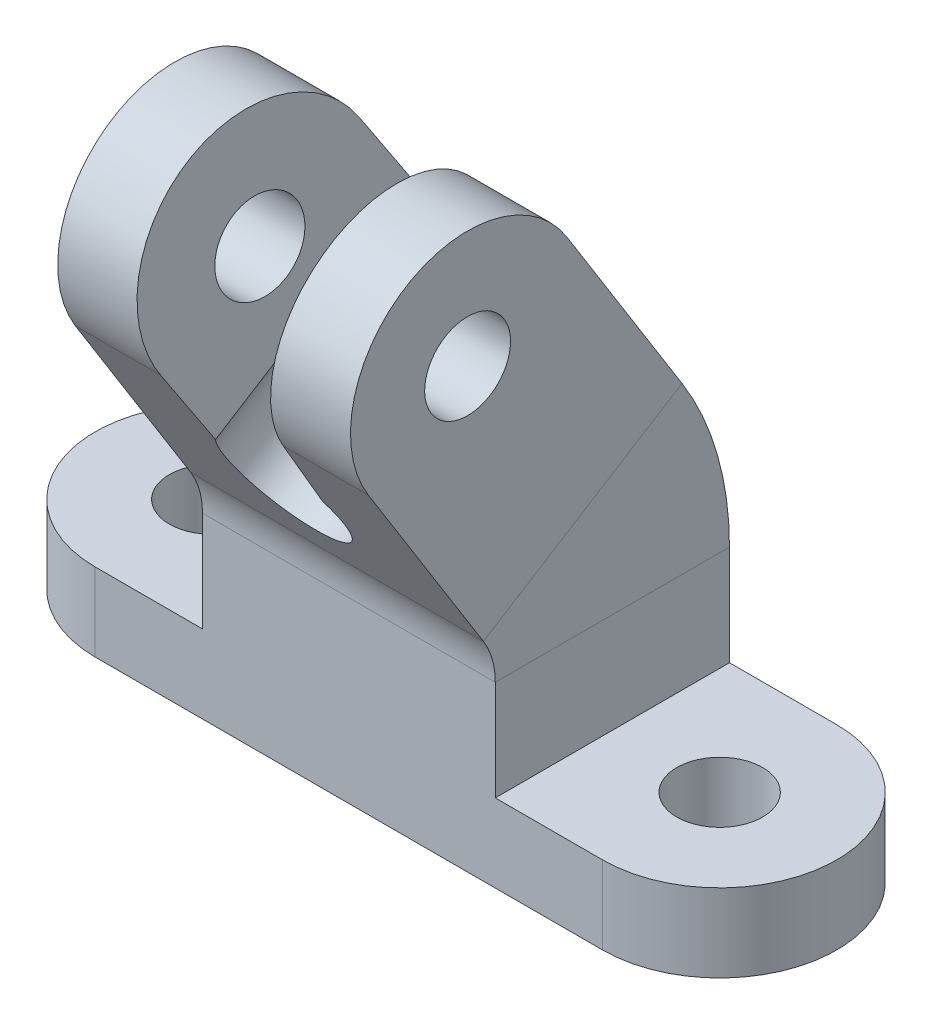
ISO-10303-21;
HEADER;
FILE_DESCRIPTION(('STEP AP214'),'2;1');
FILE_NAME('part.step','',(''),(''),'','','');
FILE_SCHEMA(('AUTOMOTIVE_DESIGN { 1 0 10303 214 1 1 1 1 }'));
ENDSEC;
DATA;
#1=APPLICATION_CONTEXT('core data for automotive mechanical design processes');
#2=APPLICATION_PROTOCOL_DEFINITION('international standard','automotive_design',2000,#1);
#3=PRODUCT_CONTEXT('',#1,'mechanical');
#4=PRODUCT('Part','Part','',(#3));
#5=PRODUCT_RELATED_PRODUCT_CATEGORY('part','',(#4));
#6=PRODUCT_DEFINITION_FORMATION('','',#4);
#7=PRODUCT_DEFINITION_CONTEXT('part definition',#1,'design');
#8=PRODUCT_DEFINITION('design','',#6,#7);
#9=PRODUCT_DEFINITION_SHAPE('','',#8);
#10=(LENGTH_UNIT() NAMED_UNIT(*) SI_UNIT(.MILLI.,.METRE.));
#11=(NAMED_UNIT(*) PLANE_ANGLE_UNIT() SI_UNIT($,.RADIAN.));
#12=(NAMED_UNIT(*) SI_UNIT($,.STERADIAN.) SOLID_ANGLE_UNIT());
#13=UNCERTAINTY_MEASURE_WITH_UNIT(LENGTH_MEASURE(1.E-05),#10,'distance_accuracy_value','');
#14=(GEOMETRIC_REPRESENTATION_CONTEXT(3) GLOBAL_UNCERTAINTY_ASSIGNED_CONTEXT((#13)) GLOBAL_UNIT_ASSIGNED_CONTEXT((#10,
#11,#12)) REPRESENTATION_CONTEXT('',''));
#15=CARTESIAN_POINT('',(0.,0.,0.));
#16=DIRECTION('',(0.,0.,1.));
#17=DIRECTION('',(1.,0.,0.));
#18=AXIS2_PLACEMENT_3D('',#15,#16,#17);
#19=CARTESIAN_POINT('',(-3.75,11.936336673095,3.70943484963244));
#20=DIRECTION('',(-1.,0.,0.));
#21=DIRECTION('',(0.,0.,1.));
#22=AXIS2_PLACEMENT_3D('',#19,#20,#21);
#23=CYLINDRICAL_SURFACE('',#22,3.);
#24=DIRECTION('',(1.,0.,0.));
#25=VECTOR('',#24,1.);
#26=CARTESIAN_POINT('',(-3.75,10.3465788803954,6.25357913810172));
#27=LINE('',#26,#25);
#28=CARTESIAN_POINT('',(-1.5718252820929,10.3465788803954,6.25357913810172));
#29=VERTEX_POINT('',#28);
#30=CARTESIAN_POINT('',(-3.75,10.3465788803954,6.25357913810172));
#31=VERTEX_POINT('',#30);
#32=EDGE_CURVE('E62',#29,#31,#27,.F.);
#33=ORIENTED_EDGE('',*,*,#32,.F.);
#34=CARTESIAN_POINT('',(-1.5718252820929,11.936336673095,3.70943484963244));
#35=DIRECTION('',(0.996194698091746,0.0739122617062452,0.0461855070705341));
#36=DIRECTION('',(-0.0871557427476517,0.84482101711783,0.527902761445799));
#37=AXIS2_PLACEMENT_3D('',#34,#35,#36);
#38=ELLIPSE('',#37,3.01145951263004,3.);
#39=CARTESIAN_POINT('',(-1.5718252820929,13.5260944657946,1.16529056116316));
#40=VERTEX_POINT('',#39);
#41=EDGE_CURVE('E164',#29,#40,#38,.F.);
#42=ORIENTED_EDGE('',*,*,#41,.T.);
#43=DIRECTION('',(1.,0.,0.));
#44=VECTOR('',#43,1.);
#45=CARTESIAN_POINT('',(-3.75,13.5260944657946,1.16529056116317));
#46=LINE('',#45,#44);
#47=CARTESIAN_POINT('',(-3.75,13.5260944657946,1.16529056116316));
#48=VERTEX_POINT('',#47);
#49=EDGE_CURVE('E288',#48,#40,#46,.T.);
#50=ORIENTED_EDGE('',*,*,#49,.F.);
#51=CARTESIAN_POINT('',(-3.75,11.936336673095,3.70943484963244));
#52=DIRECTION('',(-1.,0.,0.));
#53=DIRECTION('',(0.,0.,1.));
#54=AXIS2_PLACEMENT_3D('',#51,#52,#53);
#55=CIRCLE('',#54,3.);
#56=EDGE_CURVE('E293',#31,#48,#55,.T.);
#57=ORIENTED_EDGE('',*,*,#56,.F.);
#58=EDGE_LOOP('',(#33,#42,#50,#57));
#59=FACE_BOUND('',#58,.T.);
#60=ADVANCED_FACE('F37',(#59),#23,.T.);
#61=CARTESIAN_POINT('',(1.5718252820929,11.936336673095,3.70943484963244));
#62=DIRECTION('',(0.996194698091746,-0.0739122617062449,-0.0461855070705341));
#63=DIRECTION('',(-0.0871557427476514,-0.84482101711783,-0.527902761445799));
#64=AXIS2_PLACEMENT_3D('',#61,#62,#63);
#65=ELLIPSE('',#64,3.01145951263004,3.);
#66=CARTESIAN_POINT('',(1.5718252820929,10.3465788803954,6.25357913810172));
#67=VERTEX_POINT('',#66);
#68=CARTESIAN_POINT('',(1.5718252820929,13.5260944657946,1.16529056116316));
#69=VERTEX_POINT('',#68);
#70=EDGE_CURVE('E175',#67,#69,#65,.F.);
#71=ORIENTED_EDGE('',*,*,#70,.F.);
#72=CARTESIAN_POINT('',(3.75,10.3465788803954,6.25357913810172));
#73=VERTEX_POINT('',#72);
#74=EDGE_CURVE('E291',#73,#67,#27,.F.);
#75=ORIENTED_EDGE('',*,*,#74,.F.);
#76=CARTESIAN_POINT('',(3.75,11.936336673095,3.70943484963244));
#77=DIRECTION('',(1.,0.,0.));
#78=DIRECTION('',(0.,0.,-1.));
#79=AXIS2_PLACEMENT_3D('',#76,#77,#78);
#80=CIRCLE('',#79,3.);
#81=CARTESIAN_POINT('',(3.75,13.5260944657946,1.16529056116316));
#82=VERTEX_POINT('',#81);
#83=EDGE_CURVE('E295',#82,#73,#80,.T.);
#84=ORIENTED_EDGE('',*,*,#83,.F.);
#85=EDGE_CURVE('E283',#69,#82,#46,.T.);
#86=ORIENTED_EDGE('',*,*,#85,.F.);
#87=EDGE_LOOP('',(#71,#75,#84,#86));
#88=FACE_BOUND('',#87,.T.);
#89=ADVANCED_FACE('F40',(#88),#23,.T.);
#90=CARTESIAN_POINT('',(-6.5,2.,0.));
#91=DIRECTION('',(0.,1.,0.));
#92=DIRECTION('',(0.,0.,1.));
#93=AXIS2_PLACEMENT_3D('',#90,#91,#92);
#94=PLANE('',#93);
#95=DIRECTION('',(0.,0.,1.));
#96=VECTOR('',#95,1.);
#97=CARTESIAN_POINT('',(-3.75,2.,-3.));
#98=LINE('',#97,#96);
#99=CARTESIAN_POINT('',(-3.75,2.,-3.));
#100=VERTEX_POINT('',#99);
#101=CARTESIAN_POINT('',(-3.75,2.,3.));
#102=VERTEX_POINT('',#101);
#103=EDGE_CURVE('E177',#100,#102,#98,.T.);
#104=ORIENTED_EDGE('',*,*,#103,.F.);
#105=DIRECTION('',(-1.,0.,0.));
#106=VECTOR('',#105,1.);
#107=CARTESIAN_POINT('',(-6.5,2.,-3.));
#108=LINE('',#107,#106);
#109=CARTESIAN_POINT('',(-6.5,2.,-3.));
#110=VERTEX_POINT('',#109);
#111=EDGE_CURVE('E259',#100,#110,#108,.T.);
#112=ORIENTED_EDGE('',*,*,#111,.T.);
#113=CARTESIAN_POINT('',(-6.5,2.,0.));
#114=DIRECTION('',(0.,1.,0.));
#115=DIRECTION('',(0.,0.,1.));
#116=AXIS2_PLACEMENT_3D('',#113,#114,#115);
#117=CIRCLE('',#116,3.);
#118=CARTESIAN_POINT('',(-6.5,2.,3.));
#119=VERTEX_POINT('',#118);
#120=EDGE_CURVE('E250',#110,#119,#117,.T.);
#121=ORIENTED_EDGE('',*,*,#120,.T.);
#122=DIRECTION('',(1.,0.,0.));
#123=VECTOR('',#122,1.);
#124=CARTESIAN_POINT('',(-6.5,2.,3.));
#125=LINE('',#124,#123);
#126=EDGE_CURVE('E255',#119,#102,#125,.T.);
#127=ORIENTED_EDGE('',*,*,#126,.T.);
#128=EDGE_LOOP('',(#104,#112,#121,#127));
#129=FACE_BOUND('',#128,.T.);
#130=CARTESIAN_POINT('',(-6.5,2.,0.));
#131=DIRECTION('',(0.,1.,0.));
#132=DIRECTION('',(0.,0.,1.));
#133=AXIS2_PLACEMENT_3D('',#130,#131,#132);
#134=CIRCLE('',#133,1.1);
#135=CARTESIAN_POINT('',(-6.5,2.,1.1));
#136=VERTEX_POINT('',#135);
#137=EDGE_CURVE('E239',#136,#136,#134,.T.);
#138=ORIENTED_EDGE('',*,*,#137,.F.);
#139=EDGE_LOOP('',(#138));
#140=FACE_BOUND('',#139,.T.);
#141=ADVANCED_FACE('F326',(#129,#140),#94,.T.);
#142=CARTESIAN_POINT('',(-6.5,2.,0.));
#143=DIRECTION('',(0.,-1.,0.));
#144=DIRECTION('',(0.,0.,-1.));
#145=AXIS2_PLACEMENT_3D('',#142,#143,#144);
#146=CYLINDRICAL_SURFACE('',#145,3.);
#147=CARTESIAN_POINT('',(-6.5,0.,0.));
#148=DIRECTION('',(0.,1.,0.));
#149=DIRECTION('',(0.,0.,1.));
#150=AXIS2_PLACEMENT_3D('',#147,#148,#149);
#151=CIRCLE('',#150,3.);
#152=CARTESIAN_POINT('',(-6.5,0.,-3.));
#153=VERTEX_POINT('',#152);
#154=CARTESIAN_POINT('',(-6.5,0.,3.));
#155=VERTEX_POINT('',#154);
#156=EDGE_CURVE('E263',#153,#155,#151,.T.);
#157=ORIENTED_EDGE('',*,*,#156,.T.);
#158=DIRECTION('',(0.,-1.,0.));
#159=VECTOR('',#158,1.);
#160=CARTESIAN_POINT('',(-6.5,2.,3.));
#161=LINE('',#160,#159);
#162=EDGE_CURVE('E280',#119,#155,#161,.T.);
#163=ORIENTED_EDGE('',*,*,#162,.F.);
#164=ORIENTED_EDGE('',*,*,#120,.F.);
#165=DIRECTION('',(0.,-1.,0.));
#166=VECTOR('',#165,1.);
#167=CARTESIAN_POINT('',(-6.5,2.,-3.));
#168=LINE('',#167,#166);
#169=EDGE_CURVE('E262',#110,#153,#168,.T.);
#170=ORIENTED_EDGE('',*,*,#169,.T.);
#171=EDGE_LOOP('',(#157,#163,#164,#170));
#172=FACE_BOUND('',#171,.T.);
#173=ADVANCED_FACE('F370',(#172),#146,.T.);
#174=CARTESIAN_POINT('',(-6.5,2.,3.));
#175=DIRECTION('',(0.,0.,-1.));
#176=DIRECTION('',(-1.,0.,0.));
#177=AXIS2_PLACEMENT_3D('',#174,#175,#176);
#178=PLANE('',#177);
#179=DIRECTION('',(1.,0.,0.));
#180=VECTOR('',#179,1.);
#181=CARTESIAN_POINT('',(-6.5,0.,3.));
#182=LINE('',#181,#180);
#183=CARTESIAN_POINT('',(6.5,0.,3.));
#184=VERTEX_POINT('',#183);
#185=EDGE_CURVE('E266',#155,#184,#182,.T.);
#186=ORIENTED_EDGE('',*,*,#185,.T.);
#187=DIRECTION('',(0.,-1.,0.));
#188=VECTOR('',#187,1.);
#189=CARTESIAN_POINT('',(6.5,2.,3.));
#190=LINE('',#189,#188);
#191=CARTESIAN_POINT('',(6.5,2.,3.));
#192=VERTEX_POINT('',#191);
#193=EDGE_CURVE('E277',#192,#184,#190,.T.);
#194=ORIENTED_EDGE('',*,*,#193,.F.);
#195=CARTESIAN_POINT('',(3.75,2.,3.));
#196=VERTEX_POINT('',#195);
#197=EDGE_CURVE('E253',#196,#192,#125,.T.);
#198=ORIENTED_EDGE('',*,*,#197,.F.);
#199=DIRECTION('',(0.,1.,0.));
#200=VECTOR('',#199,1.);
#201=CARTESIAN_POINT('',(3.75,2.,3.));
#202=LINE('',#201,#200);
#203=CARTESIAN_POINT('',(3.75,4.56627307120596,3.));
#204=VERTEX_POINT('',#203);
#205=EDGE_CURVE('E212',#196,#204,#202,.T.);
#206=ORIENTED_EDGE('',*,*,#205,.T.);
#207=DIRECTION('',(1.,0.,0.));
#208=VECTOR('',#207,1.);
#209=CARTESIAN_POINT('',(3.75,4.56627307120596,3.));
#210=LINE('',#209,#208);
#211=CARTESIAN_POINT('',(-3.75,4.56627307120596,3.));
#212=VERTEX_POINT('',#211);
#213=EDGE_CURVE('E188',#212,#204,#210,.T.);
#214=ORIENTED_EDGE('',*,*,#213,.F.);
#215=DIRECTION('',(0.,1.,0.));
#216=VECTOR('',#215,1.);
#217=CARTESIAN_POINT('',(-3.75,2.,3.));
#218=LINE('',#217,#216);
#219=EDGE_CURVE('E184',#102,#212,#218,.T.);
#220=ORIENTED_EDGE('',*,*,#219,.F.);
#221=ORIENTED_EDGE('',*,*,#126,.F.);
#222=ORIENTED_EDGE('',*,*,#162,.T.);
#223=EDGE_LOOP('',(#186,#194,#198,#206,#214,#220,#221,#222));
#224=FACE_BOUND('',#223,.T.);
#225=ADVANCED_FACE('F330',(#224),#178,.F.);
#226=CARTESIAN_POINT('',(6.5,2.,0.));
#227=DIRECTION('',(0.,-1.,0.));
#228=DIRECTION('',(0.,0.,-1.));
#229=AXIS2_PLACEMENT_3D('',#226,#227,#228);
#230=CYLINDRICAL_SURFACE('',#229,3.);
#231=CARTESIAN_POINT('',(6.5,0.,0.));
#232=DIRECTION('',(0.,1.,0.));
#233=DIRECTION('',(0.,0.,1.));
#234=AXIS2_PLACEMENT_3D('',#231,#232,#233);
#235=CIRCLE('',#234,3.);
#236=CARTESIAN_POINT('',(6.5,0.,-3.));
#237=VERTEX_POINT('',#236);
#238=EDGE_CURVE('E269',#184,#237,#235,.T.);
#239=ORIENTED_EDGE('',*,*,#238,.T.);
#240=DIRECTION('',(0.,-1.,0.));
#241=VECTOR('',#240,1.);
#242=CARTESIAN_POINT('',(6.5,2.,-3.));
#243=LINE('',#242,#241);
#244=CARTESIAN_POINT('',(6.5,2.,-3.));
#245=VERTEX_POINT('',#244);
#246=EDGE_CURVE('E274',#245,#237,#243,.T.);
#247=ORIENTED_EDGE('',*,*,#246,.F.);
#248=CARTESIAN_POINT('',(6.5,2.,0.));
#249=DIRECTION('',(0.,1.,0.));
#250=DIRECTION('',(0.,0.,1.));
#251=AXIS2_PLACEMENT_3D('',#248,#249,#250);
#252=CIRCLE('',#251,3.);
#253=EDGE_CURVE('E257',#192,#245,#252,.T.);
#254=ORIENTED_EDGE('',*,*,#253,.F.);
#255=ORIENTED_EDGE('',*,*,#193,.T.);
#256=EDGE_LOOP('',(#239,#247,#254,#255));
#257=FACE_BOUND('',#256,.T.);
#258=ADVANCED_FACE('F388',(#257),#230,.T.);
#259=CARTESIAN_POINT('',(-6.5,2.,-3.));
#260=DIRECTION('',(0.,0.,1.));
#261=DIRECTION('',(1.,0.,0.));
#262=AXIS2_PLACEMENT_3D('',#259,#260,#261);
#263=PLANE('',#262);
#264=DIRECTION('',(-1.,0.,0.));
#265=VECTOR('',#264,1.);
#266=CARTESIAN_POINT('',(-6.5,0.,-3.));
#267=LINE('',#266,#265);
#268=EDGE_CURVE('E254',#237,#153,#267,.T.);
#269=ORIENTED_EDGE('',*,*,#268,.T.);
#270=ORIENTED_EDGE('',*,*,#169,.F.);
#271=ORIENTED_EDGE('',*,*,#111,.F.);
#272=DIRECTION('',(0.,1.,0.));
#273=VECTOR('',#272,1.);
#274=CARTESIAN_POINT('',(-3.75,2.,-3.));
#275=LINE('',#274,#273);
#276=CARTESIAN_POINT('',(-3.75,4.56627307120596,-3.));
#277=VERTEX_POINT('',#276);
#278=EDGE_CURVE('E185',#100,#277,#275,.T.);
#279=ORIENTED_EDGE('',*,*,#278,.T.);
#280=DIRECTION('',(-1.,0.,0.));
#281=VECTOR('',#280,1.);
#282=CARTESIAN_POINT('',(3.75,4.56627307120596,-3.));
#283=LINE('',#282,#281);
#284=CARTESIAN_POINT('',(3.75,4.56627307120596,-3.));
#285=VERTEX_POINT('',#284);
#286=EDGE_CURVE('E201',#285,#277,#283,.T.);
#287=ORIENTED_EDGE('',*,*,#286,.F.);
#288=DIRECTION('',(0.,1.,0.));
#289=VECTOR('',#288,1.);
#290=CARTESIAN_POINT('',(3.75,2.,-3.));
#291=LINE('',#290,#289);
#292=CARTESIAN_POINT('',(3.75,2.,-3.));
#293=VERTEX_POINT('',#292);
#294=EDGE_CURVE('E229',#293,#285,#291,.T.);
#295=ORIENTED_EDGE('',*,*,#294,.F.);
#296=EDGE_CURVE('E260',#245,#293,#108,.T.);
#297=ORIENTED_EDGE('',*,*,#296,.F.);
#298=ORIENTED_EDGE('',*,*,#246,.T.);
#299=EDGE_LOOP('',(#269,#270,#271,#279,#287,#295,#297,#298));
#300=FACE_BOUND('',#299,.T.);
#301=ADVANCED_FACE('F321',(#300),#263,.F.);
#302=DIRECTION('',(0.,0.,-1.));
#303=VECTOR('',#302,1.);
#304=CARTESIAN_POINT('',(3.75,2.,-3.));
#305=LINE('',#304,#303);
#306=EDGE_CURVE('E180',#196,#293,#305,.T.);
#307=ORIENTED_EDGE('',*,*,#306,.F.);
#308=ORIENTED_EDGE('',*,*,#197,.T.);
#309=ORIENTED_EDGE('',*,*,#253,.T.);
#310=ORIENTED_EDGE('',*,*,#296,.T.);
#311=EDGE_LOOP('',(#307,#308,#309,#310));
#312=FACE_BOUND('',#311,.T.);
#313=CARTESIAN_POINT('',(6.5,2.,0.));
#314=DIRECTION('',(0.,1.,0.));
#315=DIRECTION('',(0.,0.,1.));
#316=AXIS2_PLACEMENT_3D('',#313,#314,#315);
#317=CIRCLE('',#316,1.1);
#318=CARTESIAN_POINT('',(6.5,2.,1.1));
#319=VERTEX_POINT('',#318);
#320=EDGE_CURVE('E244',#319,#319,#317,.T.);
#321=ORIENTED_EDGE('',*,*,#320,.F.);
#322=EDGE_LOOP('',(#321));
#323=FACE_BOUND('',#322,.T.);
#324=ADVANCED_FACE('F372',(#312,#323),#94,.T.);
#325=CARTESIAN_POINT('',(-6.5,0.,0.));
#326=DIRECTION('',(0.,1.,0.));
#327=DIRECTION('',(0.,0.,1.));
#328=AXIS2_PLACEMENT_3D('',#325,#326,#327);
#329=PLANE('',#328);
#330=CARTESIAN_POINT('',(6.5,0.,0.));
#331=DIRECTION('',(0.,1.,0.));
#332=DIRECTION('',(0.,0.,1.));
#333=AXIS2_PLACEMENT_3D('',#330,#331,#332);
#334=CIRCLE('',#333,1.1);
#335=CARTESIAN_POINT('',(6.5,0.,1.1));
#336=VERTEX_POINT('',#335);
#337=EDGE_CURVE('E267',#336,#336,#334,.T.);
#338=ORIENTED_EDGE('',*,*,#337,.T.);
#339=EDGE_LOOP('',(#338));
#340=FACE_BOUND('',#339,.T.);
#341=CARTESIAN_POINT('',(-6.5,0.,0.));
#342=DIRECTION('',(0.,1.,0.));
#343=DIRECTION('',(0.,0.,1.));
#344=AXIS2_PLACEMENT_3D('',#341,#342,#343);
#345=CIRCLE('',#344,1.1);
#346=CARTESIAN_POINT('',(-6.5,0.,1.1));
#347=VERTEX_POINT('',#346);
#348=EDGE_CURVE('E247',#347,#347,#345,.T.);
#349=ORIENTED_EDGE('',*,*,#348,.T.);
#350=EDGE_LOOP('',(#349));
#351=FACE_BOUND('',#350,.T.);
#352=ORIENTED_EDGE('',*,*,#156,.F.);
#353=ORIENTED_EDGE('',*,*,#268,.F.);
#354=ORIENTED_EDGE('',*,*,#238,.F.);
#355=ORIENTED_EDGE('',*,*,#185,.F.);
#356=EDGE_LOOP('',(#352,#353,#354,#355));
#357=FACE_BOUND('',#356,.T.);
#358=ADVANCED_FACE('F380',(#340,#351,#357),#329,.F.);
#359=CARTESIAN_POINT('',(-6.5,-1.5,0.));
#360=DIRECTION('',(0.,1.,0.));
#361=DIRECTION('',(0.,0.,1.));
#362=AXIS2_PLACEMENT_3D('',#359,#360,#361);
#363=CYLINDRICAL_SURFACE('',#362,1.1);
#364=ORIENTED_EDGE('',*,*,#137,.T.);
#365=EDGE_LOOP('',(#364));
#366=FACE_BOUND('',#365,.T.);
#367=ORIENTED_EDGE('',*,*,#348,.F.);
#368=EDGE_LOOP('',(#367));
#369=FACE_BOUND('',#368,.T.);
#370=ADVANCED_FACE('F386',(#366,#369),#363,.F.);
#371=CARTESIAN_POINT('',(6.5,-1.5,0.));
#372=DIRECTION('',(0.,1.,0.));
#373=DIRECTION('',(0.,0.,1.));
#374=AXIS2_PLACEMENT_3D('',#371,#372,#373);
#375=CYLINDRICAL_SURFACE('',#374,1.1);
#376=ORIENTED_EDGE('',*,*,#320,.T.);
#377=EDGE_LOOP('',(#376));
#378=FACE_BOUND('',#377,.T.);
#379=ORIENTED_EDGE('',*,*,#337,.F.);
#380=EDGE_LOOP('',(#379));
#381=FACE_BOUND('',#380,.T.);
#382=ADVANCED_FACE('F393',(#378,#381),#375,.F.);
#383=CARTESIAN_POINT('',(-3.75,2.,-3.));
#384=DIRECTION('',(-1.,0.,0.));
#385=DIRECTION('',(0.,0.,1.));
#386=AXIS2_PLACEMENT_3D('',#383,#384,#385);
#387=PLANE('',#386);
#388=ORIENTED_EDGE('',*,*,#219,.T.);
#389=DIRECTION('',(0.,0.,1.));
#390=VECTOR('',#389,1.);
#391=CARTESIAN_POINT('',(-3.75,4.56627307120596,-3.));
#392=LINE('',#391,#390);
#393=EDGE_CURVE('E181',#277,#212,#392,.T.);
#394=ORIENTED_EDGE('',*,*,#393,.F.);
#395=ORIENTED_EDGE('',*,*,#278,.F.);
#396=ORIENTED_EDGE('',*,*,#103,.T.);
#397=EDGE_LOOP('',(#388,#394,#395,#396));
#398=FACE_BOUND('',#397,.T.);
#399=ADVANCED_FACE('F316',(#398),#387,.T.);
#400=CARTESIAN_POINT('',(3.75,2.,-3.));
#401=DIRECTION('',(1.,0.,0.));
#402=DIRECTION('',(0.,0.,-1.));
#403=AXIS2_PLACEMENT_3D('',#400,#401,#402);
#404=PLANE('',#403);
#405=ORIENTED_EDGE('',*,*,#294,.T.);
#406=DIRECTION('',(0.,0.,-1.));
#407=VECTOR('',#406,1.);
#408=CARTESIAN_POINT('',(3.75,4.56627307120596,-3.));
#409=LINE('',#408,#407);
#410=EDGE_CURVE('E215',#204,#285,#409,.T.);
#411=ORIENTED_EDGE('',*,*,#410,.F.);
#412=ORIENTED_EDGE('',*,*,#205,.F.);
#413=ORIENTED_EDGE('',*,*,#306,.T.);
#414=EDGE_LOOP('',(#405,#411,#412,#413));
#415=FACE_BOUND('',#414,.T.);
#416=ADVANCED_FACE('F336',(#415),#404,.T.);
#417=CARTESIAN_POINT('',(-3.75,4.56627307120596,-3.));
#418=DIRECTION('',(-1.,0.,0.));
#419=DIRECTION('',(0.,0.,1.));
#420=AXIS2_PLACEMENT_3D('',#417,#418,#419);
#421=PLANE('',#420);
#422=CARTESIAN_POINT('',(-3.75,4.56627307120596,5.));
#423=DIRECTION('',(1.,0.,0.));
#424=DIRECTION('',(0.,0.,-1.));
#425=AXIS2_PLACEMENT_3D('',#422,#423,#424);
#426=CIRCLE('',#425,2.);
#427=CARTESIAN_POINT('',(-3.75,5.62611159967237,3.30390380768715));
#428=VERTEX_POINT('',#427);
#429=EDGE_CURVE('E194',#212,#428,#426,.T.);
#430=ORIENTED_EDGE('',*,*,#429,.T.);
#431=DIRECTION('',(0.,-0.529919264233206,0.848048096156426));
#432=VECTOR('',#431,1.);
#433=CARTESIAN_POINT('',(-3.75,8.8056271850716,-1.7843847692514));
#434=LINE('',#433,#432);
#435=CARTESIAN_POINT('',(-3.75,8.8056271850716,-1.7843847692514));
#436=VERTEX_POINT('',#435);
#437=EDGE_CURVE('E191',#436,#428,#434,.T.);
#438=ORIENTED_EDGE('',*,*,#437,.F.);
#439=CARTESIAN_POINT('',(-3.75,4.56627307120596,5.));
#440=DIRECTION('',(1.,0.,0.));
#441=DIRECTION('',(0.,0.,-1.));
#442=AXIS2_PLACEMENT_3D('',#439,#440,#441);
#443=CIRCLE('',#442,8.);
#444=EDGE_CURVE('E195',#277,#436,#443,.T.);
#445=ORIENTED_EDGE('',*,*,#444,.F.);
#446=ORIENTED_EDGE('',*,*,#393,.T.);
#447=EDGE_LOOP('',(#430,#438,#445,#446));
#448=FACE_BOUND('',#447,.T.);
#449=ADVANCED_FACE('F312',(#448),#421,.T.);
#450=CARTESIAN_POINT('',(0.,4.56627307120596,5.));
#451=DIRECTION('',(1.,0.,0.));
#452=DIRECTION('',(0.,0.,-1.));
#453=AXIS2_PLACEMENT_3D('',#450,#451,#452);
#454=CYLINDRICAL_SURFACE('',#453,2.);
#455=CARTESIAN_POINT('',(3.75,4.56627307120596,5.));
#456=DIRECTION('',(1.,0.,0.));
#457=DIRECTION('',(0.,0.,-1.));
#458=AXIS2_PLACEMENT_3D('',#455,#456,#457);
#459=CIRCLE('',#458,2.);
#460=CARTESIAN_POINT('',(3.75,5.62611159967237,3.30390380768715));
#461=VERTEX_POINT('',#460);
#462=EDGE_CURVE('E218',#204,#461,#459,.T.);
#463=ORIENTED_EDGE('',*,*,#462,.T.);
#464=DIRECTION('',(1.,0.,0.));
#465=VECTOR('',#464,1.);
#466=CARTESIAN_POINT('',(3.75,5.62611159967237,3.30390380768715));
#467=LINE('',#466,#465);
#468=EDGE_CURVE('E198',#428,#461,#467,.T.);
#469=ORIENTED_EDGE('',*,*,#468,.F.);
#470=ORIENTED_EDGE('',*,*,#429,.F.);
#471=ORIENTED_EDGE('',*,*,#213,.T.);
#472=EDGE_LOOP('',(#463,#469,#470,#471));
#473=FACE_BOUND('',#472,.T.);
#474=ADVANCED_FACE('F309',(#473),#454,.F.);
#475=CARTESIAN_POINT('',(3.75,4.56627307120596,-3.));
#476=DIRECTION('',(1.,0.,0.));
#477=DIRECTION('',(0.,0.,-1.));
#478=AXIS2_PLACEMENT_3D('',#475,#476,#477);
#479=PLANE('',#478);
#480=CARTESIAN_POINT('',(3.75,4.56627307120596,5.));
#481=DIRECTION('',(1.,0.,0.));
#482=DIRECTION('',(0.,0.,-1.));
#483=AXIS2_PLACEMENT_3D('',#480,#481,#482);
#484=CIRCLE('',#483,8.);
#485=CARTESIAN_POINT('',(3.75,8.8056271850716,-1.7843847692514));
#486=VERTEX_POINT('',#485);
#487=EDGE_CURVE('E234',#285,#486,#484,.T.);
#488=ORIENTED_EDGE('',*,*,#487,.T.);
#489=DIRECTION('',(0.,0.529919264233206,-0.848048096156426));
#490=VECTOR('',#489,1.);
#491=CARTESIAN_POINT('',(3.75,8.8056271850716,-1.78438476925141));
#492=LINE('',#491,#490);
#493=EDGE_CURVE('E221',#461,#486,#492,.T.);
#494=ORIENTED_EDGE('',*,*,#493,.F.);
#495=ORIENTED_EDGE('',*,*,#462,.F.);
#496=ORIENTED_EDGE('',*,*,#410,.T.);
#497=EDGE_LOOP('',(#488,#494,#495,#496));
#498=FACE_BOUND('',#497,.T.);
#499=ADVANCED_FACE('F338',(#498),#479,.T.);
#500=CARTESIAN_POINT('',(0.,4.56627307120596,5.));
#501=DIRECTION('',(1.,0.,0.));
#502=DIRECTION('',(0.,0.,-1.));
#503=AXIS2_PLACEMENT_3D('',#500,#501,#502);
#504=CYLINDRICAL_SURFACE('',#503,8.);
#505=DIRECTION('',(-1.,0.,0.));
#506=VECTOR('',#505,1.);
#507=CARTESIAN_POINT('',(3.75,8.8056271850716,-1.78438476925141));
#508=LINE('',#507,#506);
#509=EDGE_CURVE('E209',#486,#436,#508,.T.);
#510=ORIENTED_EDGE('',*,*,#509,.F.);
#511=ORIENTED_EDGE('',*,*,#487,.F.);
#512=ORIENTED_EDGE('',*,*,#286,.T.);
#513=ORIENTED_EDGE('',*,*,#444,.T.);
#514=EDGE_LOOP('',(#510,#511,#512,#513));
#515=FACE_BOUND('',#514,.T.);
#516=ADVANCED_FACE('F351',(#515),#504,.T.);
#517=CARTESIAN_POINT('',(-3.75,8.80562718507161,-1.7843847692514));
#518=DIRECTION('',(-1.,0.,0.));
#519=DIRECTION('',(0.,0.,1.));
#520=AXIS2_PLACEMENT_3D('',#517,#518,#519);
#521=PLANE('',#520);
#522=CARTESIAN_POINT('',(-3.75,11.936336673095,3.70943484963244));
#523=DIRECTION('',(-1.,0.,0.));
#524=DIRECTION('',(0.,0.,1.));
#525=AXIS2_PLACEMENT_3D('',#522,#523,#524);
#526=CIRCLE('',#525,1.1);
#527=CARTESIAN_POINT('',(-3.75,11.936336673095,4.80943484963244));
#528=VERTEX_POINT('',#527);
#529=EDGE_CURVE('E593',#528,#528,#526,.T.);
#530=ORIENTED_EDGE('',*,*,#529,.F.);
#531=EDGE_LOOP('',(#530));
#532=FACE_BOUND('',#531,.T.);
#533=DIRECTION('',(0.,0.848048096156425,0.529919264233206));
#534=VECTOR('',#533,1.);
#535=CARTESIAN_POINT('',(-3.75,5.62611159967237,3.30390380768715));
#536=LINE('',#535,#534);
#537=EDGE_CURVE('E202',#428,#31,#536,.T.);
#538=ORIENTED_EDGE('',*,*,#537,.T.);
#539=ORIENTED_EDGE('',*,*,#56,.T.);
#540=DIRECTION('',(0.,0.848048096156425,0.529919264233206));
#541=VECTOR('',#540,1.);
#542=CARTESIAN_POINT('',(-3.75,8.80562718507161,-1.7843847692514));
#543=LINE('',#542,#541);
#544=EDGE_CURVE('E206',#436,#48,#543,.T.);
#545=ORIENTED_EDGE('',*,*,#544,.F.);
#546=ORIENTED_EDGE('',*,*,#437,.T.);
#547=EDGE_LOOP('',(#538,#539,#545,#546));
#548=FACE_BOUND('',#547,.T.);
#549=ADVANCED_FACE('F305',(#532,#548),#521,.T.);
#550=CARTESIAN_POINT('',(3.75,5.62611159967237,3.30390380768715));
#551=DIRECTION('',(0.,-0.529919264233206,0.848048096156425));
#552=DIRECTION('',(0.,-0.848048096156425,-0.529919264233206));
#553=AXIS2_PLACEMENT_3D('',#550,#551,#552);
#554=PLANE('',#553);
#555=DIRECTION('',(0.0871557427476514,0.84482101711783,0.527902761445799));
#556=VECTOR('',#555,1.);
#557=CARTESIAN_POINT('',(0.510330861890704,0.0572649755547322,-0.175897773207697));
#558=LINE('',#557,#556);
#559=CARTESIAN_POINT('',(1.37239029697692,8.41340888306769,5.04560045474102));
#560=VERTEX_POINT('',#559);
#561=EDGE_CURVE('E159',#560,#67,#558,.T.);
#562=ORIENTED_EDGE('',*,*,#561,.F.);
#563=CARTESIAN_POINT('',(0.,7.80243459192608,4.6638213454021));
#564=DIRECTION('',(0.,-0.529919264233206,0.848048096156425));
#565=DIRECTION('',(0.,-0.848048096156425,-0.529919264233206));
#566=AXIS2_PLACEMENT_3D('',#563,#564,#565);
#567=CIRCLE('',#566,1.55);
#568=CARTESIAN_POINT('',(-1.37239029697691,8.41340888306769,5.04560045474102));
#569=VERTEX_POINT('',#568);
#570=EDGE_CURVE('E154',#569,#560,#567,.T.);
#571=ORIENTED_EDGE('',*,*,#570,.F.);
#572=DIRECTION('',(-0.0871557427476517,0.84482101711783,0.527902761445799));
#573=VECTOR('',#572,1.);
#574=CARTESIAN_POINT('',(-0.5103308618907,0.0572649755547323,-0.175897773207696));
#575=LINE('',#574,#573);
#576=EDGE_CURVE('E161',#569,#29,#575,.T.);
#577=ORIENTED_EDGE('',*,*,#576,.T.);
#578=ORIENTED_EDGE('',*,*,#32,.T.);
#579=ORIENTED_EDGE('',*,*,#537,.F.);
#580=ORIENTED_EDGE('',*,*,#468,.T.);
#581=DIRECTION('',(0.,0.848048096156425,0.529919264233206));
#582=VECTOR('',#581,1.);
#583=CARTESIAN_POINT('',(3.75,5.62611159967237,3.30390380768715));
#584=LINE('',#583,#582);
#585=EDGE_CURVE('E205',#461,#73,#584,.T.);
#586=ORIENTED_EDGE('',*,*,#585,.T.);
#587=ORIENTED_EDGE('',*,*,#74,.T.);
#588=EDGE_LOOP('',(#562,#571,#577,#578,#579,#580,#586,#587));
#589=FACE_BOUND('',#588,.T.);
#590=ADVANCED_FACE('F167',(#589),#554,.T.);
#591=CARTESIAN_POINT('',(3.75,8.80562718507161,-1.7843847692514));
#592=DIRECTION('',(1.,0.,0.));
#593=DIRECTION('',(0.,0.,-1.));
#594=AXIS2_PLACEMENT_3D('',#591,#592,#593);
#595=PLANE('',#594);
#596=CARTESIAN_POINT('',(3.75,11.936336673095,3.70943484963244));
#597=DIRECTION('',(1.,0.,0.));
#598=DIRECTION('',(0.,0.,-1.));
#599=AXIS2_PLACEMENT_3D('',#596,#597,#598);
#600=CIRCLE('',#599,1.1);
#601=CARTESIAN_POINT('',(3.75,11.936336673095,2.60943484963244));
#602=VERTEX_POINT('',#601);
#603=EDGE_CURVE('E165',#602,#602,#600,.T.);
#604=ORIENTED_EDGE('',*,*,#603,.F.);
#605=EDGE_LOOP('',(#604));
#606=FACE_BOUND('',#605,.T.);
#607=DIRECTION('',(0.,0.848048096156425,0.529919264233206));
#608=VECTOR('',#607,1.);
#609=CARTESIAN_POINT('',(3.75,8.80562718507161,-1.7843847692514));
#610=LINE('',#609,#608);
#611=EDGE_CURVE('E224',#486,#82,#610,.T.);
#612=ORIENTED_EDGE('',*,*,#611,.T.);
#613=ORIENTED_EDGE('',*,*,#83,.T.);
#614=ORIENTED_EDGE('',*,*,#585,.F.);
#615=ORIENTED_EDGE('',*,*,#493,.T.);
#616=EDGE_LOOP('',(#612,#613,#614,#615));
#617=FACE_BOUND('',#616,.T.);
#618=ADVANCED_FACE('F341',(#606,#617),#595,.T.);
#619=CARTESIAN_POINT('',(3.75,8.80562718507161,-1.7843847692514));
#620=DIRECTION('',(0.,0.529919264233206,-0.848048096156425));
#621=DIRECTION('',(0.,0.848048096156425,0.529919264233206));
#622=AXIS2_PLACEMENT_3D('',#619,#620,#621);
#623=PLANE('',#622);
#624=DIRECTION('',(-0.0871557427476514,-0.84482101711783,-0.527902761445799));
#625=VECTOR('',#624,1.);
#626=CARTESIAN_POINT('',(1.10508437863573,9.00186562718707,-1.66176138110702));
#627=LINE('',#626,#625);
#628=CARTESIAN_POINT('',(1.37239029697691,11.5929244684669,-0.0426881221975346));
#629=VERTEX_POINT('',#628);
#630=EDGE_CURVE('E11',#69,#629,#627,.T.);
#631=ORIENTED_EDGE('',*,*,#630,.F.);
#632=ORIENTED_EDGE('',*,*,#85,.T.);
#633=ORIENTED_EDGE('',*,*,#611,.F.);
#634=ORIENTED_EDGE('',*,*,#509,.T.);
#635=ORIENTED_EDGE('',*,*,#544,.T.);
#636=ORIENTED_EDGE('',*,*,#49,.T.);
#637=DIRECTION('',(0.0871557427476517,-0.84482101711783,-0.527902761445799));
#638=VECTOR('',#637,1.);
#639=CARTESIAN_POINT('',(-1.04811345243152,8.44963310291909,-2.0068345606496));
#640=LINE('',#639,#638);
#641=CARTESIAN_POINT('',(-1.37239029697691,11.592924468467,-0.0426881221975207));
#642=VERTEX_POINT('',#641);
#643=EDGE_CURVE('E297',#40,#642,#640,.T.);
#644=ORIENTED_EDGE('',*,*,#643,.T.);
#645=CARTESIAN_POINT('',(0.,10.9819501773253,-0.424467231536453));
#646=DIRECTION('',(0.,0.529919264233206,-0.848048096156425));
#647=DIRECTION('',(0.,0.848048096156425,0.529919264233206));
#648=AXIS2_PLACEMENT_3D('',#645,#646,#647);
#649=CIRCLE('',#648,1.55);
#650=EDGE_CURVE('E47',#629,#642,#649,.T.);
#651=ORIENTED_EDGE('',*,*,#650,.F.);
#652=EDGE_LOOP('',(#631,#632,#633,#634,#635,#636,#644,#651));
#653=FACE_BOUND('',#652,.T.);
#654=ADVANCED_FACE('F301',(#653),#623,.T.);
#655=CARTESIAN_POINT('',(0.510330861890703,5.35645761788679,-8.65637873477195));
#656=DIRECTION('',(0.996194698091746,-0.0739122617062449,-0.0461855070705341));
#657=DIRECTION('',(0.0739912192089934,0.997258892905933,0.));
#658=AXIS2_PLACEMENT_3D('',#655,#656,#657);
#659=PLANE('',#658);
#660=CARTESIAN_POINT('',(1.5718252820929,11.936336673095,3.70943484963244));
#661=DIRECTION('',(0.996194698091746,-0.0739122617062449,-0.0461855070705341));
#662=DIRECTION('',(-0.0871557427476514,-0.844821017117831,-0.527902761445798));
#663=AXIS2_PLACEMENT_3D('',#660,#661,#662);
#664=ELLIPSE('',#663,1.10420182129768,1.1);
#665=CARTESIAN_POINT('',(1.47558775221439,11.0034837673229,3.12652365897591));
#666=VERTEX_POINT('',#665);
#667=EDGE_CURVE('E590',#666,#666,#664,.T.);
#668=ORIENTED_EDGE('',*,*,#667,.T.);
#669=EDGE_LOOP('',(#668));
#670=FACE_BOUND('',#669,.T.);
#671=ORIENTED_EDGE('',*,*,#70,.T.);
#672=ORIENTED_EDGE('',*,*,#630,.T.);
#673=DIRECTION('',(0.,-0.529919264233206,0.848048096156425));
#674=VECTOR('',#673,1.);
#675=CARTESIAN_POINT('',(1.37239029697691,13.7126015253998,-3.43488050682324));
#676=LINE('',#675,#674);
#677=EDGE_CURVE('E158',#629,#560,#676,.T.);
#678=ORIENTED_EDGE('',*,*,#677,.T.);
#679=ORIENTED_EDGE('',*,*,#561,.T.);
#680=EDGE_LOOP('',(#671,#672,#678,#679));
#681=FACE_BOUND('',#680,.T.);
#682=ADVANCED_FACE('F348',(#670,#681),#659,.F.);
#683=CARTESIAN_POINT('',(0.,13.1016272342581,-3.81665961616216));
#684=DIRECTION('',(0.,-0.529919264233206,0.848048096156425));
#685=DIRECTION('',(0.,-0.848048096156425,-0.529919264233206));
#686=AXIS2_PLACEMENT_3D('',#683,#684,#685);
#687=CYLINDRICAL_SURFACE('',#686,1.55);
#688=ORIENTED_EDGE('',*,*,#650,.T.);
#689=DIRECTION('',(0.,-0.529919264233206,0.848048096156425));
#690=VECTOR('',#689,1.);
#691=CARTESIAN_POINT('',(-1.37239029697692,13.7126015253997,-3.43488050682324));
#692=LINE('',#691,#690);
#693=EDGE_CURVE('E54',#642,#569,#692,.T.);
#694=ORIENTED_EDGE('',*,*,#693,.T.);
#695=ORIENTED_EDGE('',*,*,#570,.T.);
#696=ORIENTED_EDGE('',*,*,#677,.F.);
#697=EDGE_LOOP('',(#688,#694,#695,#696));
#698=FACE_BOUND('',#697,.T.);
#699=ADVANCED_FACE('F151',(#698),#687,.F.);
#700=CARTESIAN_POINT('',(-0.510330861890701,5.35645761788679,-8.65637873477195));
#701=DIRECTION('',(0.996194698091746,0.0739122617062452,0.0461855070705341));
#702=DIRECTION('',(-0.0739912192089937,0.997258892905933,0.));
#703=AXIS2_PLACEMENT_3D('',#700,#701,#702);
#704=PLANE('',#703);
#705=CARTESIAN_POINT('',(-1.5718252820929,11.936336673095,3.70943484963244));
#706=DIRECTION('',(0.996194698091746,0.0739122617062452,0.0461855070705341));
#707=DIRECTION('',(-0.0871557427476517,0.84482101711783,0.5279027614458));
#708=AXIS2_PLACEMENT_3D('',#705,#706,#707);
#709=ELLIPSE('',#708,1.10420182129768,1.1);
#710=CARTESIAN_POINT('',(-1.66806281197141,12.869189578867,4.29234604028897));
#711=VERTEX_POINT('',#710);
#712=EDGE_CURVE('E42',#711,#711,#709,.T.);
#713=ORIENTED_EDGE('',*,*,#712,.F.);
#714=EDGE_LOOP('',(#713));
#715=FACE_BOUND('',#714,.T.);
#716=ORIENTED_EDGE('',*,*,#576,.F.);
#717=ORIENTED_EDGE('',*,*,#693,.F.);
#718=ORIENTED_EDGE('',*,*,#643,.F.);
#719=ORIENTED_EDGE('',*,*,#41,.F.);
#720=EDGE_LOOP('',(#716,#717,#718,#719));
#721=FACE_BOUND('',#720,.T.);
#722=ADVANCED_FACE('F162',(#715,#721),#704,.T.);
#723=CARTESIAN_POINT('',(6.25,11.936336673095,3.70943484963244));
#724=DIRECTION('',(-1.,0.,0.));
#725=DIRECTION('',(0.,0.,1.));
#726=AXIS2_PLACEMENT_3D('',#723,#724,#725);
#727=CYLINDRICAL_SURFACE('',#726,1.1);
#728=ORIENTED_EDGE('',*,*,#712,.T.);
#729=EDGE_LOOP('',(#728));
#730=FACE_BOUND('',#729,.T.);
#731=ORIENTED_EDGE('',*,*,#529,.T.);
#732=EDGE_LOOP('',(#731));
#733=FACE_BOUND('',#732,.T.);
#734=ADVANCED_FACE('F557',(#730,#733),#727,.F.);
#735=ORIENTED_EDGE('',*,*,#603,.T.);
#736=EDGE_LOOP('',(#735));
#737=FACE_BOUND('',#736,.T.);
#738=ORIENTED_EDGE('',*,*,#667,.F.);
#739=EDGE_LOOP('',(#738));
#740=FACE_BOUND('',#739,.T.);
#741=ADVANCED_FACE('F566',(#737,#740),#727,.F.);
#742=CLOSED_SHELL('',(#60,#89,#141,#173,#225,#258,#301,#324,#358,#370,#382,#399,#416,#449,#474,
#499,#516,#549,#590,#618,#654,#682,#699,#722,#734,#741));
#743=MANIFOLD_SOLID_BREP('B2',#742);
#744=ADVANCED_BREP_SHAPE_REPRESENTATION('',(#18,#743),#14);
#745=SHAPE_DEFINITION_REPRESENTATION(#9,#744);
ENDSEC;
END-ISO-10303-21;
